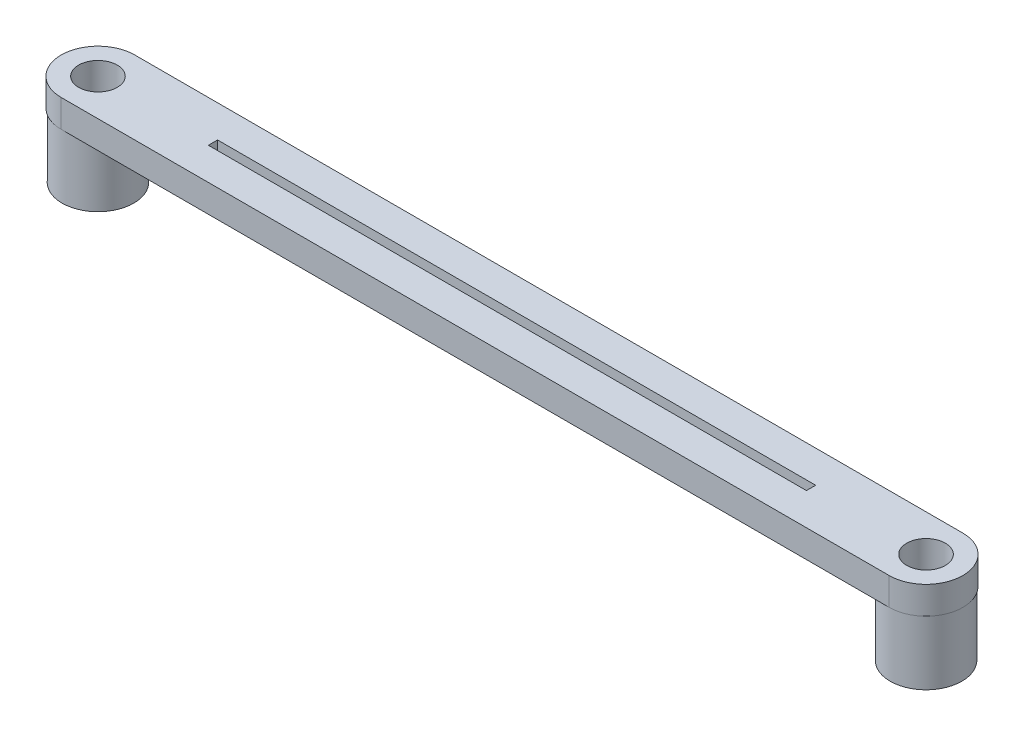
ISO-10303-21;
HEADER;
FILE_DESCRIPTION(('STEP AP214'),'2;1');
FILE_NAME('part.step','',(''),(''),'','','');
FILE_SCHEMA(('AUTOMOTIVE_DESIGN { 1 0 10303 214 1 1 1 1 }'));
ENDSEC;
DATA;
#1=APPLICATION_CONTEXT('core data for automotive mechanical design processes');
#2=APPLICATION_PROTOCOL_DEFINITION('international standard','automotive_design',2000,#1);
#3=PRODUCT_CONTEXT('',#1,'mechanical');
#4=PRODUCT('Part','Part','',(#3));
#5=PRODUCT_RELATED_PRODUCT_CATEGORY('part','',(#4));
#6=PRODUCT_DEFINITION_FORMATION('','',#4);
#7=PRODUCT_DEFINITION_CONTEXT('part definition',#1,'design');
#8=PRODUCT_DEFINITION('design','',#6,#7);
#9=PRODUCT_DEFINITION_SHAPE('','',#8);
#10=(LENGTH_UNIT() NAMED_UNIT(*) SI_UNIT(.MILLI.,.METRE.));
#11=(NAMED_UNIT(*) PLANE_ANGLE_UNIT() SI_UNIT($,.RADIAN.));
#12=(NAMED_UNIT(*) SI_UNIT($,.STERADIAN.) SOLID_ANGLE_UNIT());
#13=UNCERTAINTY_MEASURE_WITH_UNIT(LENGTH_MEASURE(1.E-05),#10,'distance_accuracy_value','');
#14=(GEOMETRIC_REPRESENTATION_CONTEXT(3) GLOBAL_UNCERTAINTY_ASSIGNED_CONTEXT((#13)) GLOBAL_UNIT_ASSIGNED_CONTEXT((#10,
#11,#12)) REPRESENTATION_CONTEXT('',''));
#15=CARTESIAN_POINT('',(0.,0.,0.));
#16=DIRECTION('',(0.,0.,1.));
#17=DIRECTION('',(1.,0.,0.));
#18=AXIS2_PLACEMENT_3D('',#15,#16,#17);
#19=CARTESIAN_POINT('',(-45.,-3.,0.));
#20=DIRECTION('',(0.,1.,0.));
#21=DIRECTION('',(0.,0.,1.));
#22=AXIS2_PLACEMENT_3D('',#19,#20,#21);
#23=PLANE('',#22);
#24=CARTESIAN_POINT('',(45.,-3.,0.));
#25=DIRECTION('',(0.,1.,0.));
#26=DIRECTION('',(0.,0.,1.));
#27=AXIS2_PLACEMENT_3D('',#24,#25,#26);
#28=CIRCLE('',#27,3.9);
#29=CARTESIAN_POINT('',(45.,-3.,3.89999999999998));
#30=VERTEX_POINT('',#29);
#31=EDGE_CURVE('E53',#30,#30,#28,.F.);
#32=ORIENTED_EDGE('',*,*,#31,.F.);
#33=EDGE_LOOP('',(#32));
#34=FACE_BOUND('',#33,.T.);
#35=CARTESIAN_POINT('',(-45.,-3.,0.));
#36=DIRECTION('',(0.,1.,0.));
#37=DIRECTION('',(0.,0.,1.));
#38=AXIS2_PLACEMENT_3D('',#35,#36,#37);
#39=CIRCLE('',#38,4.);
#40=CARTESIAN_POINT('',(-45.,-3.,-4.));
#41=VERTEX_POINT('',#40);
#42=CARTESIAN_POINT('',(-45.,-3.,4.));
#43=VERTEX_POINT('',#42);
#44=EDGE_CURVE('E176',#41,#43,#39,.T.);
#45=ORIENTED_EDGE('',*,*,#44,.F.);
#46=DIRECTION('',(-1.,0.,0.));
#47=VECTOR('',#46,1.);
#48=CARTESIAN_POINT('',(-45.,-3.,-4.));
#49=LINE('',#48,#47);
#50=CARTESIAN_POINT('',(45.,-3.,-4.00000000000002));
#51=VERTEX_POINT('',#50);
#52=EDGE_CURVE('E184',#51,#41,#49,.T.);
#53=ORIENTED_EDGE('',*,*,#52,.F.);
#54=CARTESIAN_POINT('',(45.,-3.,0.));
#55=DIRECTION('',(0.,1.,0.));
#56=DIRECTION('',(0.,0.,1.));
#57=AXIS2_PLACEMENT_3D('',#54,#55,#56);
#58=CIRCLE('',#57,4.);
#59=CARTESIAN_POINT('',(45.,-3.,3.99999999999998));
#60=VERTEX_POINT('',#59);
#61=EDGE_CURVE('E181',#60,#51,#58,.T.);
#62=ORIENTED_EDGE('',*,*,#61,.F.);
#63=DIRECTION('',(1.,0.,0.));
#64=VECTOR('',#63,1.);
#65=CARTESIAN_POINT('',(-45.,-3.,4.));
#66=LINE('',#65,#64);
#67=EDGE_CURVE('E178',#43,#60,#66,.T.);
#68=ORIENTED_EDGE('',*,*,#67,.F.);
#69=EDGE_LOOP('',(#45,#53,#62,#68));
#70=FACE_BOUND('',#69,.T.);
#71=CARTESIAN_POINT('',(-45.,-3.,0.));
#72=DIRECTION('',(0.,1.,0.));
#73=DIRECTION('',(0.,0.,1.));
#74=AXIS2_PLACEMENT_3D('',#71,#72,#73);
#75=CIRCLE('',#74,3.9);
#76=CARTESIAN_POINT('',(-45.,-3.,3.9));
#77=VERTEX_POINT('',#76);
#78=EDGE_CURVE('E12',#77,#77,#75,.F.);
#79=ORIENTED_EDGE('',*,*,#78,.F.);
#80=EDGE_LOOP('',(#79));
#81=FACE_BOUND('',#80,.T.);
#82=ADVANCED_FACE('F45',(#34,#70,#81),#23,.F.);
#83=CARTESIAN_POINT('',(-45.,-3.,0.));
#84=DIRECTION('',(0.,1.,0.));
#85=DIRECTION('',(0.,0.,1.));
#86=AXIS2_PLACEMENT_3D('',#83,#84,#85);
#87=CYLINDRICAL_SURFACE('',#86,4.);
#88=CARTESIAN_POINT('',(-45.,0.,0.));
#89=DIRECTION('',(0.,1.,0.));
#90=DIRECTION('',(0.,0.,1.));
#91=AXIS2_PLACEMENT_3D('',#88,#89,#90);
#92=CIRCLE('',#91,4.);
#93=CARTESIAN_POINT('',(-45.,0.,-4.));
#94=VERTEX_POINT('',#93);
#95=CARTESIAN_POINT('',(-45.,0.,4.));
#96=VERTEX_POINT('',#95);
#97=EDGE_CURVE('E175',#94,#96,#92,.T.);
#98=ORIENTED_EDGE('',*,*,#97,.F.);
#99=DIRECTION('',(0.,1.,0.));
#100=VECTOR('',#99,1.);
#101=CARTESIAN_POINT('',(-45.,-3.,-4.));
#102=LINE('',#101,#100);
#103=EDGE_CURVE('E69',#41,#94,#102,.T.);
#104=ORIENTED_EDGE('',*,*,#103,.F.);
#105=ORIENTED_EDGE('',*,*,#44,.T.);
#106=DIRECTION('',(0.,1.,0.));
#107=VECTOR('',#106,1.);
#108=CARTESIAN_POINT('',(-45.,-3.,4.));
#109=LINE('',#108,#107);
#110=EDGE_CURVE('E95',#43,#96,#109,.T.);
#111=ORIENTED_EDGE('',*,*,#110,.T.);
#112=EDGE_LOOP('',(#98,#104,#105,#111));
#113=FACE_BOUND('',#112,.T.);
#114=ADVANCED_FACE('F47',(#113),#87,.T.);
#115=CARTESIAN_POINT('',(-45.,-3.,-4.));
#116=DIRECTION('',(0.,0.,-1.));
#117=DIRECTION('',(-1.,0.,0.));
#118=AXIS2_PLACEMENT_3D('',#115,#116,#117);
#119=PLANE('',#118);
#120=DIRECTION('',(-1.,0.,0.));
#121=VECTOR('',#120,1.);
#122=CARTESIAN_POINT('',(-45.,0.,-4.));
#123=LINE('',#122,#121);
#124=CARTESIAN_POINT('',(45.,0.,-4.00000000000002));
#125=VERTEX_POINT('',#124);
#126=EDGE_CURVE('E179',#125,#94,#123,.T.);
#127=ORIENTED_EDGE('',*,*,#126,.F.);
#128=DIRECTION('',(0.,1.,0.));
#129=VECTOR('',#128,1.);
#130=CARTESIAN_POINT('',(45.,-3.,-4.00000000000002));
#131=LINE('',#130,#129);
#132=EDGE_CURVE('E197',#51,#125,#131,.T.);
#133=ORIENTED_EDGE('',*,*,#132,.F.);
#134=ORIENTED_EDGE('',*,*,#52,.T.);
#135=ORIENTED_EDGE('',*,*,#103,.T.);
#136=EDGE_LOOP('',(#127,#133,#134,#135));
#137=FACE_BOUND('',#136,.T.);
#138=ADVANCED_FACE('F248',(#137),#119,.T.);
#139=CARTESIAN_POINT('',(45.,-3.,0.));
#140=DIRECTION('',(0.,1.,0.));
#141=DIRECTION('',(0.,0.,1.));
#142=AXIS2_PLACEMENT_3D('',#139,#140,#141);
#143=CYLINDRICAL_SURFACE('',#142,4.);
#144=CARTESIAN_POINT('',(45.,0.,0.));
#145=DIRECTION('',(0.,1.,0.));
#146=DIRECTION('',(0.,0.,1.));
#147=AXIS2_PLACEMENT_3D('',#144,#145,#146);
#148=CIRCLE('',#147,4.);
#149=CARTESIAN_POINT('',(45.,0.,3.99999999999998));
#150=VERTEX_POINT('',#149);
#151=EDGE_CURVE('E191',#150,#125,#148,.T.);
#152=ORIENTED_EDGE('',*,*,#151,.F.);
#153=DIRECTION('',(0.,1.,0.));
#154=VECTOR('',#153,1.);
#155=CARTESIAN_POINT('',(45.,-3.,3.99999999999998));
#156=LINE('',#155,#154);
#157=EDGE_CURVE('E199',#60,#150,#156,.T.);
#158=ORIENTED_EDGE('',*,*,#157,.F.);
#159=ORIENTED_EDGE('',*,*,#61,.T.);
#160=ORIENTED_EDGE('',*,*,#132,.T.);
#161=EDGE_LOOP('',(#152,#158,#159,#160));
#162=FACE_BOUND('',#161,.T.);
#163=ADVANCED_FACE('F251',(#162),#143,.T.);
#164=CARTESIAN_POINT('',(-45.,-3.,4.));
#165=DIRECTION('',(0.,0.,1.));
#166=DIRECTION('',(1.,0.,0.));
#167=AXIS2_PLACEMENT_3D('',#164,#165,#166);
#168=PLANE('',#167);
#169=DIRECTION('',(1.,0.,0.));
#170=VECTOR('',#169,1.);
#171=CARTESIAN_POINT('',(-45.,0.,4.));
#172=LINE('',#171,#170);
#173=EDGE_CURVE('E188',#96,#150,#172,.T.);
#174=ORIENTED_EDGE('',*,*,#173,.F.);
#175=ORIENTED_EDGE('',*,*,#110,.F.);
#176=ORIENTED_EDGE('',*,*,#67,.T.);
#177=ORIENTED_EDGE('',*,*,#157,.T.);
#178=EDGE_LOOP('',(#174,#175,#176,#177));
#179=FACE_BOUND('',#178,.T.);
#180=ADVANCED_FACE('F246',(#179),#168,.T.);
#181=CARTESIAN_POINT('',(-45.,0.,0.));
#182=DIRECTION('',(0.,1.,0.));
#183=DIRECTION('',(0.,0.,1.));
#184=AXIS2_PLACEMENT_3D('',#181,#182,#183);
#185=PLANE('',#184);
#186=DIRECTION('',(0.,0.,1.));
#187=VECTOR('',#186,1.);
#188=CARTESIAN_POINT('',(-32.5,0.,0.5));
#189=LINE('',#188,#187);
#190=CARTESIAN_POINT('',(-32.5,0.,-0.5));
#191=VERTEX_POINT('',#190);
#192=CARTESIAN_POINT('',(-32.5,0.,0.5));
#193=VERTEX_POINT('',#192);
#194=EDGE_CURVE('E60',#191,#193,#189,.T.);
#195=ORIENTED_EDGE('',*,*,#194,.F.);
#196=DIRECTION('',(-1.,0.,0.));
#197=VECTOR('',#196,1.);
#198=CARTESIAN_POINT('',(32.5,0.,-0.5));
#199=LINE('',#198,#197);
#200=CARTESIAN_POINT('',(32.5,0.,-0.5));
#201=VERTEX_POINT('',#200);
#202=EDGE_CURVE('E139',#201,#191,#199,.T.);
#203=ORIENTED_EDGE('',*,*,#202,.F.);
#204=DIRECTION('',(0.,0.,-1.));
#205=VECTOR('',#204,1.);
#206=CARTESIAN_POINT('',(32.5,0.,0.5));
#207=LINE('',#206,#205);
#208=CARTESIAN_POINT('',(32.5,0.,0.5));
#209=VERTEX_POINT('',#208);
#210=EDGE_CURVE('E142',#209,#201,#207,.T.);
#211=ORIENTED_EDGE('',*,*,#210,.F.);
#212=DIRECTION('',(1.,0.,0.));
#213=VECTOR('',#212,1.);
#214=CARTESIAN_POINT('',(32.5,0.,0.5));
#215=LINE('',#214,#213);
#216=EDGE_CURVE('E148',#193,#209,#215,.T.);
#217=ORIENTED_EDGE('',*,*,#216,.F.);
#218=EDGE_LOOP('',(#195,#203,#211,#217));
#219=FACE_BOUND('',#218,.T.);
#220=CARTESIAN_POINT('',(45.,0.,0.));
#221=DIRECTION('',(0.,1.,0.));
#222=DIRECTION('',(0.,0.,1.));
#223=AXIS2_PLACEMENT_3D('',#220,#221,#222);
#224=CIRCLE('',#223,2.1);
#225=CARTESIAN_POINT('',(45.,0.,2.09999999999998));
#226=VERTEX_POINT('',#225);
#227=EDGE_CURVE('E169',#226,#226,#224,.T.);
#228=ORIENTED_EDGE('',*,*,#227,.F.);
#229=EDGE_LOOP('',(#228));
#230=FACE_BOUND('',#229,.T.);
#231=CARTESIAN_POINT('',(-45.,0.,0.));
#232=DIRECTION('',(0.,1.,0.));
#233=DIRECTION('',(0.,0.,1.));
#234=AXIS2_PLACEMENT_3D('',#231,#232,#233);
#235=CIRCLE('',#234,2.1);
#236=CARTESIAN_POINT('',(-45.,0.,2.1));
#237=VERTEX_POINT('',#236);
#238=EDGE_CURVE('E172',#237,#237,#235,.T.);
#239=ORIENTED_EDGE('',*,*,#238,.F.);
#240=EDGE_LOOP('',(#239));
#241=FACE_BOUND('',#240,.T.);
#242=ORIENTED_EDGE('',*,*,#97,.T.);
#243=ORIENTED_EDGE('',*,*,#173,.T.);
#244=ORIENTED_EDGE('',*,*,#151,.T.);
#245=ORIENTED_EDGE('',*,*,#126,.T.);
#246=EDGE_LOOP('',(#242,#243,#244,#245));
#247=FACE_BOUND('',#246,.T.);
#248=ADVANCED_FACE('F241',(#219,#230,#241,#247),#185,.T.);
#249=CARTESIAN_POINT('',(-45.,-3.,0.));
#250=DIRECTION('',(0.,1.,0.));
#251=DIRECTION('',(0.,0.,1.));
#252=AXIS2_PLACEMENT_3D('',#249,#250,#251);
#253=CYLINDRICAL_SURFACE('',#252,2.1);
#254=ORIENTED_EDGE('',*,*,#238,.T.);
#255=EDGE_LOOP('',(#254));
#256=FACE_BOUND('',#255,.T.);
#257=CARTESIAN_POINT('',(-45.,-10.,0.));
#258=DIRECTION('',(0.,-1.,0.));
#259=DIRECTION('',(0.,0.,-1.));
#260=AXIS2_PLACEMENT_3D('',#257,#258,#259);
#261=CIRCLE('',#260,2.1);
#262=CARTESIAN_POINT('',(-45.,-10.,-2.1));
#263=VERTEX_POINT('',#262);
#264=EDGE_CURVE('E154',#263,#263,#261,.T.);
#265=ORIENTED_EDGE('',*,*,#264,.T.);
#266=EDGE_LOOP('',(#265));
#267=FACE_BOUND('',#266,.T.);
#268=ADVANCED_FACE('F238',(#256,#267),#253,.F.);
#269=CARTESIAN_POINT('',(45.,-3.,0.));
#270=DIRECTION('',(0.,1.,0.));
#271=DIRECTION('',(0.,0.,1.));
#272=AXIS2_PLACEMENT_3D('',#269,#270,#271);
#273=CYLINDRICAL_SURFACE('',#272,2.1);
#274=ORIENTED_EDGE('',*,*,#227,.T.);
#275=EDGE_LOOP('',(#274));
#276=FACE_BOUND('',#275,.T.);
#277=CARTESIAN_POINT('',(45.,-10.,0.));
#278=DIRECTION('',(0.,-1.,0.));
#279=DIRECTION('',(0.,0.,-1.));
#280=AXIS2_PLACEMENT_3D('',#277,#278,#279);
#281=CIRCLE('',#280,2.1);
#282=CARTESIAN_POINT('',(45.,-10.,-2.10000000000001));
#283=VERTEX_POINT('',#282);
#284=EDGE_CURVE('E163',#283,#283,#281,.T.);
#285=ORIENTED_EDGE('',*,*,#284,.T.);
#286=EDGE_LOOP('',(#285));
#287=FACE_BOUND('',#286,.T.);
#288=ADVANCED_FACE('F231',(#276,#287),#273,.F.);
#289=CARTESIAN_POINT('',(45.,-10.,0.));
#290=DIRECTION('',(0.,-1.,0.));
#291=DIRECTION('',(0.,0.,-1.));
#292=AXIS2_PLACEMENT_3D('',#289,#290,#291);
#293=PLANE('',#292);
#294=CARTESIAN_POINT('',(45.,-10.,0.));
#295=DIRECTION('',(0.,-1.,0.));
#296=DIRECTION('',(1.,0.,0.));
#297=AXIS2_PLACEMENT_3D('',#294,#295,#296);
#298=CIRCLE('',#297,3.9);
#299=CARTESIAN_POINT('',(48.9,-10.,0.));
#300=VERTEX_POINT('',#299);
#301=EDGE_CURVE('E166',#300,#300,#298,.T.);
#302=ORIENTED_EDGE('',*,*,#301,.T.);
#303=EDGE_LOOP('',(#302));
#304=FACE_BOUND('',#303,.T.);
#305=ORIENTED_EDGE('',*,*,#284,.F.);
#306=EDGE_LOOP('',(#305));
#307=FACE_BOUND('',#306,.T.);
#308=ADVANCED_FACE('F228',(#304,#307),#293,.T.);
#309=CARTESIAN_POINT('',(45.,-10.,0.));
#310=DIRECTION('',(0.,1.,0.));
#311=DIRECTION('',(0.,0.,1.));
#312=AXIS2_PLACEMENT_3D('',#309,#310,#311);
#313=CYLINDRICAL_SURFACE('',#312,3.9);
#314=ORIENTED_EDGE('',*,*,#301,.F.);
#315=EDGE_LOOP('',(#314));
#316=FACE_BOUND('',#315,.T.);
#317=ORIENTED_EDGE('',*,*,#31,.T.);
#318=EDGE_LOOP('',(#317));
#319=FACE_BOUND('',#318,.T.);
#320=ADVANCED_FACE('F204',(#316,#319),#313,.T.);
#321=CARTESIAN_POINT('',(-45.,-10.,0.));
#322=DIRECTION('',(0.,-1.,0.));
#323=DIRECTION('',(0.,0.,-1.));
#324=AXIS2_PLACEMENT_3D('',#321,#322,#323);
#325=PLANE('',#324);
#326=CARTESIAN_POINT('',(-45.,-10.,0.));
#327=DIRECTION('',(0.,-1.,0.));
#328=DIRECTION('',(1.,0.,0.));
#329=AXIS2_PLACEMENT_3D('',#326,#327,#328);
#330=CIRCLE('',#329,3.9);
#331=CARTESIAN_POINT('',(-41.1,-10.,0.));
#332=VERTEX_POINT('',#331);
#333=EDGE_CURVE('E160',#332,#332,#330,.T.);
#334=ORIENTED_EDGE('',*,*,#333,.T.);
#335=EDGE_LOOP('',(#334));
#336=FACE_BOUND('',#335,.T.);
#337=ORIENTED_EDGE('',*,*,#264,.F.);
#338=EDGE_LOOP('',(#337));
#339=FACE_BOUND('',#338,.T.);
#340=ADVANCED_FACE('F215',(#336,#339),#325,.T.);
#341=CARTESIAN_POINT('',(-45.,-10.,0.));
#342=DIRECTION('',(0.,1.,0.));
#343=DIRECTION('',(0.,0.,1.));
#344=AXIS2_PLACEMENT_3D('',#341,#342,#343);
#345=CYLINDRICAL_SURFACE('',#344,3.9);
#346=ORIENTED_EDGE('',*,*,#333,.F.);
#347=EDGE_LOOP('',(#346));
#348=FACE_BOUND('',#347,.T.);
#349=ORIENTED_EDGE('',*,*,#78,.T.);
#350=EDGE_LOOP('',(#349));
#351=FACE_BOUND('',#350,.T.);
#352=ADVANCED_FACE('F213',(#348,#351),#345,.T.);
#353=CARTESIAN_POINT('',(-32.5,-1.,0.5));
#354=DIRECTION('',(-1.,0.,0.));
#355=DIRECTION('',(0.,0.,1.));
#356=AXIS2_PLACEMENT_3D('',#353,#354,#355);
#357=PLANE('',#356);
#358=ORIENTED_EDGE('',*,*,#194,.T.);
#359=DIRECTION('',(0.,1.,0.));
#360=VECTOR('',#359,1.);
#361=CARTESIAN_POINT('',(-32.5,-1.,0.5));
#362=LINE('',#361,#360);
#363=CARTESIAN_POINT('',(-32.5,-1.,0.5));
#364=VERTEX_POINT('',#363);
#365=EDGE_CURVE('E117',#364,#193,#362,.T.);
#366=ORIENTED_EDGE('',*,*,#365,.F.);
#367=DIRECTION('',(0.,0.,1.));
#368=VECTOR('',#367,1.);
#369=CARTESIAN_POINT('',(-32.5,-1.,0.5));
#370=LINE('',#369,#368);
#371=CARTESIAN_POINT('',(-32.5,-1.,-0.5));
#372=VERTEX_POINT('',#371);
#373=EDGE_CURVE('E121',#372,#364,#370,.T.);
#374=ORIENTED_EDGE('',*,*,#373,.F.);
#375=DIRECTION('',(0.,1.,0.));
#376=VECTOR('',#375,1.);
#377=CARTESIAN_POINT('',(-32.5,-1.,-0.5));
#378=LINE('',#377,#376);
#379=EDGE_CURVE('E152',#372,#191,#378,.T.);
#380=ORIENTED_EDGE('',*,*,#379,.T.);
#381=EDGE_LOOP('',(#358,#366,#374,#380));
#382=FACE_BOUND('',#381,.T.);
#383=ADVANCED_FACE('F119',(#382),#357,.F.);
#384=CARTESIAN_POINT('',(32.5,-1.,-0.5));
#385=DIRECTION('',(0.,0.,-1.));
#386=DIRECTION('',(-1.,0.,0.));
#387=AXIS2_PLACEMENT_3D('',#384,#385,#386);
#388=PLANE('',#387);
#389=ORIENTED_EDGE('',*,*,#202,.T.);
#390=ORIENTED_EDGE('',*,*,#379,.F.);
#391=DIRECTION('',(-1.,0.,0.));
#392=VECTOR('',#391,1.);
#393=CARTESIAN_POINT('',(32.5,-1.,-0.5));
#394=LINE('',#393,#392);
#395=CARTESIAN_POINT('',(32.5,-1.,-0.5));
#396=VERTEX_POINT('',#395);
#397=EDGE_CURVE('E127',#396,#372,#394,.T.);
#398=ORIENTED_EDGE('',*,*,#397,.F.);
#399=DIRECTION('',(0.,1.,0.));
#400=VECTOR('',#399,1.);
#401=CARTESIAN_POINT('',(32.5,-1.,-0.5));
#402=LINE('',#401,#400);
#403=EDGE_CURVE('E155',#396,#201,#402,.T.);
#404=ORIENTED_EDGE('',*,*,#403,.T.);
#405=EDGE_LOOP('',(#389,#390,#398,#404));
#406=FACE_BOUND('',#405,.T.);
#407=ADVANCED_FACE('F222',(#406),#388,.F.);
#408=CARTESIAN_POINT('',(32.5,-1.,0.5));
#409=DIRECTION('',(1.,0.,0.));
#410=DIRECTION('',(0.,0.,-1.));
#411=AXIS2_PLACEMENT_3D('',#408,#409,#410);
#412=PLANE('',#411);
#413=ORIENTED_EDGE('',*,*,#210,.T.);
#414=ORIENTED_EDGE('',*,*,#403,.F.);
#415=DIRECTION('',(0.,0.,-1.));
#416=VECTOR('',#415,1.);
#417=CARTESIAN_POINT('',(32.5,-1.,0.5));
#418=LINE('',#417,#416);
#419=CARTESIAN_POINT('',(32.5,-1.,0.5));
#420=VERTEX_POINT('',#419);
#421=EDGE_CURVE('E135',#420,#396,#418,.T.);
#422=ORIENTED_EDGE('',*,*,#421,.F.);
#423=DIRECTION('',(0.,1.,0.));
#424=VECTOR('',#423,1.);
#425=CARTESIAN_POINT('',(32.5,-1.,0.5));
#426=LINE('',#425,#424);
#427=EDGE_CURVE('E126',#420,#209,#426,.T.);
#428=ORIENTED_EDGE('',*,*,#427,.T.);
#429=EDGE_LOOP('',(#413,#414,#422,#428));
#430=FACE_BOUND('',#429,.T.);
#431=ADVANCED_FACE('F337',(#430),#412,.F.);
#432=CARTESIAN_POINT('',(32.5,-1.,0.5));
#433=DIRECTION('',(0.,0.,1.));
#434=DIRECTION('',(1.,0.,0.));
#435=AXIS2_PLACEMENT_3D('',#432,#433,#434);
#436=PLANE('',#435);
#437=ORIENTED_EDGE('',*,*,#216,.T.);
#438=ORIENTED_EDGE('',*,*,#427,.F.);
#439=DIRECTION('',(1.,0.,0.));
#440=VECTOR('',#439,1.);
#441=CARTESIAN_POINT('',(32.5,-1.,0.5));
#442=LINE('',#441,#440);
#443=EDGE_CURVE('E130',#364,#420,#442,.T.);
#444=ORIENTED_EDGE('',*,*,#443,.F.);
#445=ORIENTED_EDGE('',*,*,#365,.T.);
#446=EDGE_LOOP('',(#437,#438,#444,#445));
#447=FACE_BOUND('',#446,.T.);
#448=ADVANCED_FACE('F131',(#447),#436,.F.);
#449=CARTESIAN_POINT('',(0.,-1.,0.));
#450=DIRECTION('',(0.,1.,0.));
#451=DIRECTION('',(0.,0.,1.));
#452=AXIS2_PLACEMENT_3D('',#449,#450,#451);
#453=PLANE('',#452);
#454=ORIENTED_EDGE('',*,*,#373,.T.);
#455=ORIENTED_EDGE('',*,*,#443,.T.);
#456=ORIENTED_EDGE('',*,*,#421,.T.);
#457=ORIENTED_EDGE('',*,*,#397,.T.);
#458=EDGE_LOOP('',(#454,#455,#456,#457));
#459=FACE_BOUND('',#458,.T.);
#460=ADVANCED_FACE('F137',(#459),#453,.T.);
#461=CLOSED_SHELL('',(#82,#114,#138,#163,#180,#248,#268,#288,#308,#320,#340,#352,#383,#407,#431,
#448,#460));
#462=MANIFOLD_SOLID_BREP('B2',#461);
#463=ADVANCED_BREP_SHAPE_REPRESENTATION('',(#18,#462),#14);
#464=SHAPE_DEFINITION_REPRESENTATION(#9,#463);
ENDSEC;
END-ISO-10303-21;
